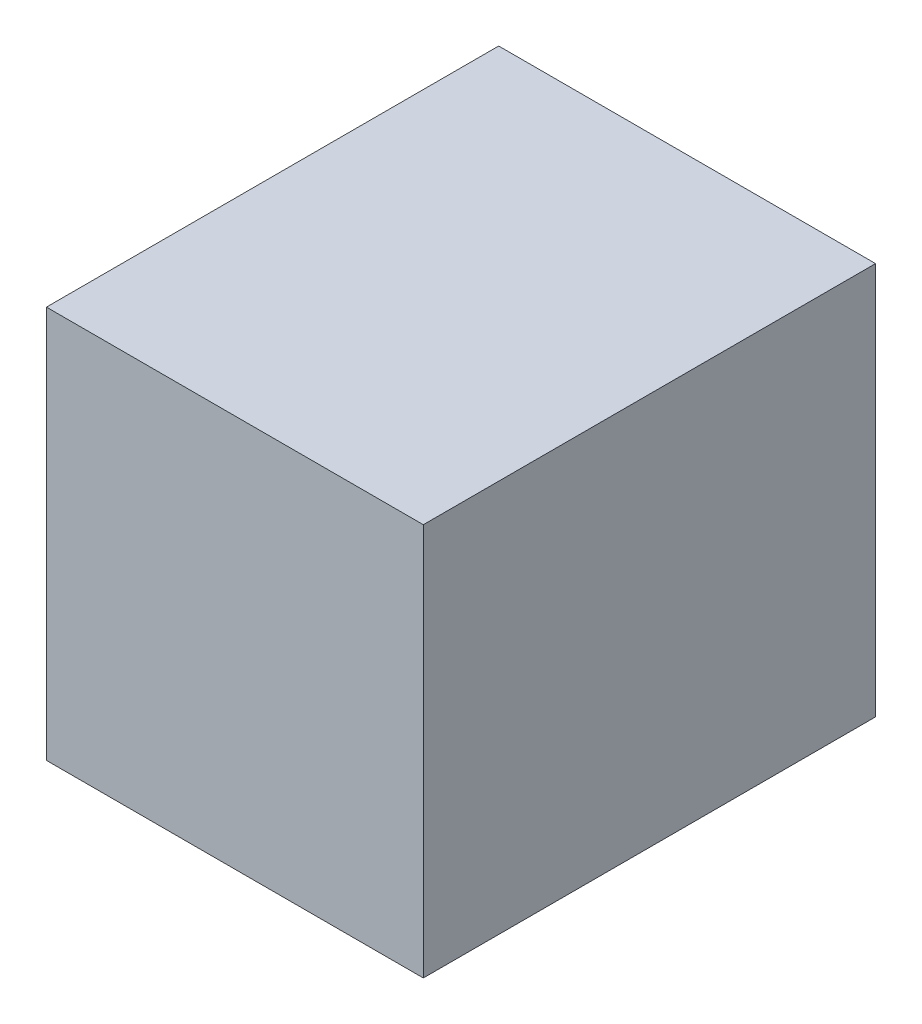
ISO-10303-21;
HEADER;
FILE_DESCRIPTION(('STEP AP214'),'2;1');
FILE_NAME('part.step','',(''),(''),'','','');
FILE_SCHEMA(('AUTOMOTIVE_DESIGN { 1 0 10303 214 1 1 1 1 }'));
ENDSEC;
DATA;
#1=APPLICATION_CONTEXT('core data for automotive mechanical design processes');
#2=APPLICATION_PROTOCOL_DEFINITION('international standard','automotive_design',2000,#1);
#3=PRODUCT_CONTEXT('',#1,'mechanical');
#4=PRODUCT('Part','Part','',(#3));
#5=PRODUCT_RELATED_PRODUCT_CATEGORY('part','',(#4));
#6=PRODUCT_DEFINITION_FORMATION('','',#4);
#7=PRODUCT_DEFINITION_CONTEXT('part definition',#1,'design');
#8=PRODUCT_DEFINITION('design','',#6,#7);
#9=PRODUCT_DEFINITION_SHAPE('','',#8);
#10=(LENGTH_UNIT() NAMED_UNIT(*) SI_UNIT(.MILLI.,.METRE.));
#11=(NAMED_UNIT(*) PLANE_ANGLE_UNIT() SI_UNIT($,.RADIAN.));
#12=(NAMED_UNIT(*) SI_UNIT($,.STERADIAN.) SOLID_ANGLE_UNIT());
#13=UNCERTAINTY_MEASURE_WITH_UNIT(LENGTH_MEASURE(1.E-05),#10,'distance_accuracy_value','');
#14=(GEOMETRIC_REPRESENTATION_CONTEXT(3) GLOBAL_UNCERTAINTY_ASSIGNED_CONTEXT((#13)) GLOBAL_UNIT_ASSIGNED_CONTEXT((#10,
#11,#12)) REPRESENTATION_CONTEXT('',''));
#15=CARTESIAN_POINT('',(0.,0.,0.));
#16=DIRECTION('',(0.,0.,1.));
#17=DIRECTION('',(1.,0.,0.));
#18=AXIS2_PLACEMENT_3D('',#15,#16,#17);
#19=CARTESIAN_POINT('',(-30.,62.5,36.));
#20=DIRECTION('',(1.,0.,0.));
#21=DIRECTION('',(0.,0.,-1.));
#22=AXIS2_PLACEMENT_3D('',#19,#20,#21);
#23=PLANE('',#22);
#24=DIRECTION('',(0.,0.,1.));
#25=VECTOR('',#24,1.);
#26=CARTESIAN_POINT('',(-30.,0.,36.));
#27=LINE('',#26,#25);
#28=CARTESIAN_POINT('',(-30.,0.,-36.));
#29=VERTEX_POINT('',#28);
#30=CARTESIAN_POINT('',(-30.,0.,36.));
#31=VERTEX_POINT('',#30);
#32=EDGE_CURVE('E111',#29,#31,#27,.T.);
#33=ORIENTED_EDGE('',*,*,#32,.T.);
#34=DIRECTION('',(0.,-1.,0.));
#35=VECTOR('',#34,1.);
#36=CARTESIAN_POINT('',(-30.,62.5,36.));
#37=LINE('',#36,#35);
#38=CARTESIAN_POINT('',(-30.,62.5,36.));
#39=VERTEX_POINT('',#38);
#40=EDGE_CURVE('E11',#39,#31,#37,.T.);
#41=ORIENTED_EDGE('',*,*,#40,.F.);
#42=DIRECTION('',(0.,0.,1.));
#43=VECTOR('',#42,1.);
#44=CARTESIAN_POINT('',(-30.,62.5,36.));
#45=LINE('',#44,#43);
#46=CARTESIAN_POINT('',(-30.,62.5,-36.));
#47=VERTEX_POINT('',#46);
#48=EDGE_CURVE('E95',#47,#39,#45,.T.);
#49=ORIENTED_EDGE('',*,*,#48,.F.);
#50=DIRECTION('',(0.,-1.,0.));
#51=VECTOR('',#50,1.);
#52=CARTESIAN_POINT('',(-30.,62.5,-36.));
#53=LINE('',#52,#51);
#54=EDGE_CURVE('E107',#47,#29,#53,.T.);
#55=ORIENTED_EDGE('',*,*,#54,.T.);
#56=EDGE_LOOP('',(#33,#41,#49,#55));
#57=FACE_BOUND('',#56,.T.);
#58=ADVANCED_FACE('F43',(#57),#23,.F.);
#59=CARTESIAN_POINT('',(30.,62.5,36.));
#60=DIRECTION('',(0.,0.,-1.));
#61=DIRECTION('',(-1.,0.,0.));
#62=AXIS2_PLACEMENT_3D('',#59,#60,#61);
#63=PLANE('',#62);
#64=DIRECTION('',(1.,0.,0.));
#65=VECTOR('',#64,1.);
#66=CARTESIAN_POINT('',(30.,0.,36.));
#67=LINE('',#66,#65);
#68=CARTESIAN_POINT('',(30.,0.,36.));
#69=VERTEX_POINT('',#68);
#70=EDGE_CURVE('E100',#31,#69,#67,.T.);
#71=ORIENTED_EDGE('',*,*,#70,.T.);
#72=DIRECTION('',(0.,-1.,0.));
#73=VECTOR('',#72,1.);
#74=CARTESIAN_POINT('',(30.,62.5,36.));
#75=LINE('',#74,#73);
#76=CARTESIAN_POINT('',(30.,62.5,36.));
#77=VERTEX_POINT('',#76);
#78=EDGE_CURVE('E52',#77,#69,#75,.T.);
#79=ORIENTED_EDGE('',*,*,#78,.F.);
#80=DIRECTION('',(1.,0.,0.));
#81=VECTOR('',#80,1.);
#82=CARTESIAN_POINT('',(30.,62.5,36.));
#83=LINE('',#82,#81);
#84=EDGE_CURVE('E90',#39,#77,#83,.T.);
#85=ORIENTED_EDGE('',*,*,#84,.F.);
#86=ORIENTED_EDGE('',*,*,#40,.T.);
#87=EDGE_LOOP('',(#71,#79,#85,#86));
#88=FACE_BOUND('',#87,.T.);
#89=ADVANCED_FACE('F99',(#88),#63,.F.);
#90=CARTESIAN_POINT('',(30.,62.5,36.));
#91=DIRECTION('',(-1.,0.,0.));
#92=DIRECTION('',(0.,0.,1.));
#93=AXIS2_PLACEMENT_3D('',#90,#91,#92);
#94=PLANE('',#93);
#95=DIRECTION('',(0.,0.,-1.));
#96=VECTOR('',#95,1.);
#97=CARTESIAN_POINT('',(30.,0.,36.));
#98=LINE('',#97,#96);
#99=CARTESIAN_POINT('',(30.,0.,-36.));
#100=VERTEX_POINT('',#99);
#101=EDGE_CURVE('E77',#69,#100,#98,.T.);
#102=ORIENTED_EDGE('',*,*,#101,.T.);
#103=DIRECTION('',(0.,-1.,0.));
#104=VECTOR('',#103,1.);
#105=CARTESIAN_POINT('',(30.,62.5,-36.));
#106=LINE('',#105,#104);
#107=CARTESIAN_POINT('',(30.,62.5,-36.));
#108=VERTEX_POINT('',#107);
#109=EDGE_CURVE('E102',#108,#100,#106,.T.);
#110=ORIENTED_EDGE('',*,*,#109,.F.);
#111=DIRECTION('',(0.,0.,-1.));
#112=VECTOR('',#111,1.);
#113=CARTESIAN_POINT('',(30.,62.5,36.));
#114=LINE('',#113,#112);
#115=EDGE_CURVE('E93',#77,#108,#114,.T.);
#116=ORIENTED_EDGE('',*,*,#115,.F.);
#117=ORIENTED_EDGE('',*,*,#78,.T.);
#118=EDGE_LOOP('',(#102,#110,#116,#117));
#119=FACE_BOUND('',#118,.T.);
#120=ADVANCED_FACE('F103',(#119),#94,.F.);
#121=CARTESIAN_POINT('',(30.,62.5,-36.));
#122=DIRECTION('',(0.,0.,1.));
#123=DIRECTION('',(1.,0.,0.));
#124=AXIS2_PLACEMENT_3D('',#121,#122,#123);
#125=PLANE('',#124);
#126=DIRECTION('',(-1.,0.,0.));
#127=VECTOR('',#126,1.);
#128=CARTESIAN_POINT('',(30.,0.,-36.));
#129=LINE('',#128,#127);
#130=EDGE_CURVE('E83',#100,#29,#129,.T.);
#131=ORIENTED_EDGE('',*,*,#130,.T.);
#132=ORIENTED_EDGE('',*,*,#54,.F.);
#133=DIRECTION('',(-1.,0.,0.));
#134=VECTOR('',#133,1.);
#135=CARTESIAN_POINT('',(30.,62.5,-36.));
#136=LINE('',#135,#134);
#137=EDGE_CURVE('E60',#108,#47,#136,.T.);
#138=ORIENTED_EDGE('',*,*,#137,.F.);
#139=ORIENTED_EDGE('',*,*,#109,.T.);
#140=EDGE_LOOP('',(#131,#132,#138,#139));
#141=FACE_BOUND('',#140,.T.);
#142=ADVANCED_FACE('F124',(#141),#125,.F.);
#143=CARTESIAN_POINT('',(0.,62.5,0.));
#144=DIRECTION('',(0.,1.,0.));
#145=DIRECTION('',(0.,0.,1.));
#146=AXIS2_PLACEMENT_3D('',#143,#144,#145);
#147=PLANE('',#146);
#148=ORIENTED_EDGE('',*,*,#48,.T.);
#149=ORIENTED_EDGE('',*,*,#84,.T.);
#150=ORIENTED_EDGE('',*,*,#115,.T.);
#151=ORIENTED_EDGE('',*,*,#137,.T.);
#152=EDGE_LOOP('',(#148,#149,#150,#151));
#153=FACE_BOUND('',#152,.T.);
#154=ADVANCED_FACE('F91',(#153),#147,.T.);
#155=CARTESIAN_POINT('',(0.,0.,0.));
#156=DIRECTION('',(0.,1.,0.));
#157=DIRECTION('',(0.,0.,1.));
#158=AXIS2_PLACEMENT_3D('',#155,#156,#157);
#159=PLANE('',#158);
#160=ORIENTED_EDGE('',*,*,#32,.F.);
#161=ORIENTED_EDGE('',*,*,#130,.F.);
#162=ORIENTED_EDGE('',*,*,#101,.F.);
#163=ORIENTED_EDGE('',*,*,#70,.F.);
#164=EDGE_LOOP('',(#160,#161,#162,#163));
#165=FACE_BOUND('',#164,.T.);
#166=ADVANCED_FACE('F127',(#165),#159,.F.);
#167=CLOSED_SHELL('',(#58,#89,#120,#142,#154,#166));
#168=MANIFOLD_SOLID_BREP('B2',#167);
#169=ADVANCED_BREP_SHAPE_REPRESENTATION('',(#18,#168),#14);
#170=SHAPE_DEFINITION_REPRESENTATION(#9,#169);
ENDSEC;
END-ISO-10303-21;
